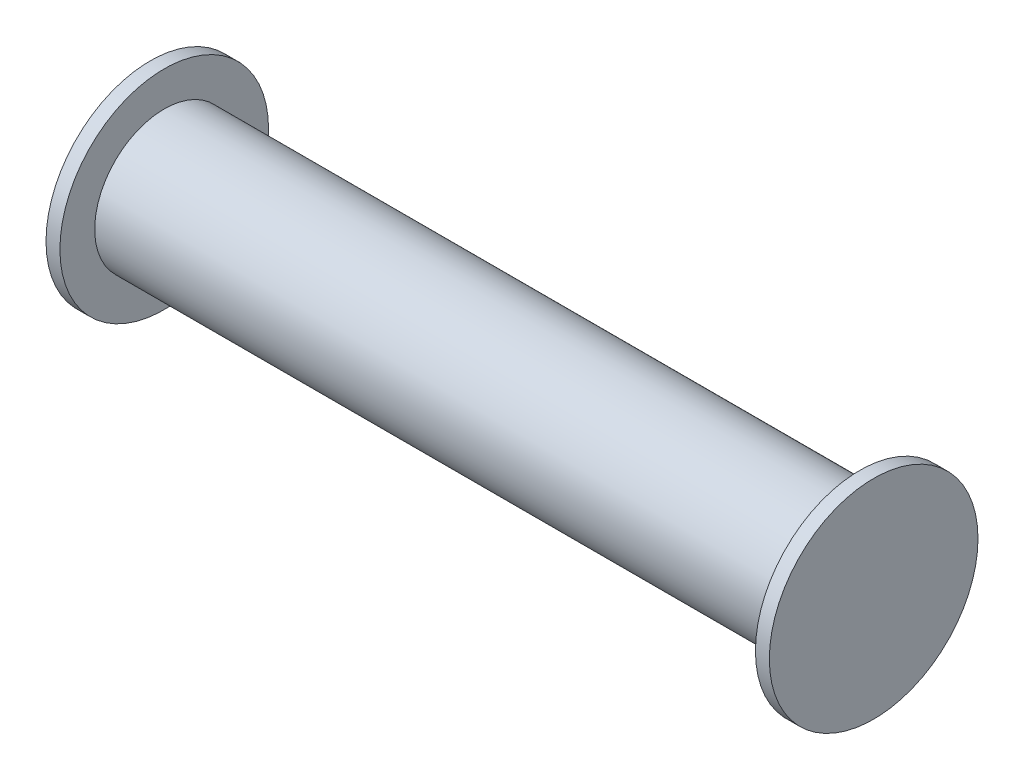
ISO-10303-21;
HEADER;
FILE_DESCRIPTION(('STEP AP214'),'2;1');
FILE_NAME('part.step','',(''),(''),'','','');
FILE_SCHEMA(('AUTOMOTIVE_DESIGN { 1 0 10303 214 1 1 1 1 }'));
ENDSEC;
DATA;
#1=APPLICATION_CONTEXT('core data for automotive mechanical design processes');
#2=APPLICATION_PROTOCOL_DEFINITION('international standard','automotive_design',2000,#1);
#3=PRODUCT_CONTEXT('',#1,'mechanical');
#4=PRODUCT('Part','Part','',(#3));
#5=PRODUCT_RELATED_PRODUCT_CATEGORY('part','',(#4));
#6=PRODUCT_DEFINITION_FORMATION('','',#4);
#7=PRODUCT_DEFINITION_CONTEXT('part definition',#1,'design');
#8=PRODUCT_DEFINITION('design','',#6,#7);
#9=PRODUCT_DEFINITION_SHAPE('','',#8);
#10=(LENGTH_UNIT() NAMED_UNIT(*) SI_UNIT(.MILLI.,.METRE.));
#11=(NAMED_UNIT(*) PLANE_ANGLE_UNIT() SI_UNIT($,.RADIAN.));
#12=(NAMED_UNIT(*) SI_UNIT($,.STERADIAN.) SOLID_ANGLE_UNIT());
#13=UNCERTAINTY_MEASURE_WITH_UNIT(LENGTH_MEASURE(1.E-05),#10,'distance_accuracy_value','');
#14=(GEOMETRIC_REPRESENTATION_CONTEXT(3) GLOBAL_UNCERTAINTY_ASSIGNED_CONTEXT((#13)) GLOBAL_UNIT_ASSIGNED_CONTEXT((#10,
#11,#12)) REPRESENTATION_CONTEXT('',''));
#15=CARTESIAN_POINT('',(0.,0.,0.));
#16=DIRECTION('',(0.,0.,1.));
#17=DIRECTION('',(1.,0.,0.));
#18=AXIS2_PLACEMENT_3D('',#15,#16,#17);
#19=CARTESIAN_POINT('',(-52.,0.,0.));
#20=DIRECTION('',(1.,0.,0.));
#21=DIRECTION('',(0.,0.,-1.));
#22=AXIS2_PLACEMENT_3D('',#19,#20,#21);
#23=CYLINDRICAL_SURFACE('',#22,15.);
#24=CARTESIAN_POINT('',(-52.,0.,0.));
#25=DIRECTION('',(-1.,0.,0.));
#26=DIRECTION('',(0.,0.,1.));
#27=AXIS2_PLACEMENT_3D('',#24,#25,#26);
#28=CIRCLE('',#27,15.);
#29=CARTESIAN_POINT('',(-52.,0.,15.));
#30=VERTEX_POINT('',#29);
#31=EDGE_CURVE('E11',#30,#30,#28,.T.);
#32=ORIENTED_EDGE('',*,*,#31,.F.);
#33=EDGE_LOOP('',(#32));
#34=FACE_BOUND('',#33,.T.);
#35=CARTESIAN_POINT('',(-50.,0.,0.));
#36=DIRECTION('',(-1.,0.,0.));
#37=DIRECTION('',(0.,0.,1.));
#38=AXIS2_PLACEMENT_3D('',#35,#36,#37);
#39=CIRCLE('',#38,15.);
#40=CARTESIAN_POINT('',(-50.,0.,15.));
#41=VERTEX_POINT('',#40);
#42=EDGE_CURVE('E51',#41,#41,#39,.T.);
#43=ORIENTED_EDGE('',*,*,#42,.T.);
#44=EDGE_LOOP('',(#43));
#45=FACE_BOUND('',#44,.T.);
#46=ADVANCED_FACE('F48',(#34,#45),#23,.T.);
#47=CARTESIAN_POINT('',(-52.,0.,0.));
#48=DIRECTION('',(-1.,0.,0.));
#49=DIRECTION('',(0.,0.,1.));
#50=AXIS2_PLACEMENT_3D('',#47,#48,#49);
#51=PLANE('',#50);
#52=ORIENTED_EDGE('',*,*,#31,.T.);
#53=EDGE_LOOP('',(#52));
#54=FACE_BOUND('',#53,.T.);
#55=ADVANCED_FACE('F63',(#54),#51,.T.);
#56=CARTESIAN_POINT('',(-50.,0.,0.));
#57=DIRECTION('',(-1.,0.,0.));
#58=DIRECTION('',(0.,0.,1.));
#59=AXIS2_PLACEMENT_3D('',#56,#57,#58);
#60=PLANE('',#59);
#61=ORIENTED_EDGE('',*,*,#42,.F.);
#62=EDGE_LOOP('',(#61));
#63=FACE_BOUND('',#62,.T.);
#64=ADVANCED_FACE('F61',(#63),#60,.F.);
#65=CLOSED_SHELL('',(#46,#55,#64));
#66=MANIFOLD_SOLID_BREP('B2',#65);
#67=CARTESIAN_POINT('',(52.,0.,0.));
#68=DIRECTION('',(-1.,0.,0.));
#69=DIRECTION('',(0.,0.,1.));
#70=AXIS2_PLACEMENT_3D('',#67,#68,#69);
#71=CYLINDRICAL_SURFACE('',#70,15.);
#72=CARTESIAN_POINT('',(52.,0.,0.));
#73=DIRECTION('',(1.,0.,0.));
#74=DIRECTION('',(0.,0.,-1.));
#75=AXIS2_PLACEMENT_3D('',#72,#73,#74);
#76=CIRCLE('',#75,15.);
#77=CARTESIAN_POINT('',(52.,0.,-15.));
#78=VERTEX_POINT('',#77);
#79=EDGE_CURVE('E47',#78,#78,#76,.T.);
#80=ORIENTED_EDGE('',*,*,#79,.F.);
#81=EDGE_LOOP('',(#80));
#82=FACE_BOUND('',#81,.T.);
#83=CARTESIAN_POINT('',(50.,0.,0.));
#84=DIRECTION('',(1.,0.,0.));
#85=DIRECTION('',(0.,0.,-1.));
#86=AXIS2_PLACEMENT_3D('',#83,#84,#85);
#87=CIRCLE('',#86,15.);
#88=CARTESIAN_POINT('',(50.,0.,-15.));
#89=VERTEX_POINT('',#88);
#90=EDGE_CURVE('E103',#89,#89,#87,.T.);
#91=ORIENTED_EDGE('',*,*,#90,.T.);
#92=EDGE_LOOP('',(#91));
#93=FACE_BOUND('',#92,.T.);
#94=ADVANCED_FACE('F100',(#82,#93),#71,.T.);
#95=CARTESIAN_POINT('',(52.,0.,0.));
#96=DIRECTION('',(1.,0.,0.));
#97=DIRECTION('',(0.,0.,-1.));
#98=AXIS2_PLACEMENT_3D('',#95,#96,#97);
#99=PLANE('',#98);
#100=ORIENTED_EDGE('',*,*,#79,.T.);
#101=EDGE_LOOP('',(#100));
#102=FACE_BOUND('',#101,.T.);
#103=ADVANCED_FACE('F115',(#102),#99,.T.);
#104=CARTESIAN_POINT('',(50.,0.,0.));
#105=DIRECTION('',(1.,0.,0.));
#106=DIRECTION('',(0.,0.,-1.));
#107=AXIS2_PLACEMENT_3D('',#104,#105,#106);
#108=PLANE('',#107);
#109=ORIENTED_EDGE('',*,*,#90,.F.);
#110=EDGE_LOOP('',(#109));
#111=FACE_BOUND('',#110,.T.);
#112=ADVANCED_FACE('F113',(#111),#108,.F.);
#113=CLOSED_SHELL('',(#94,#103,#112));
#114=MANIFOLD_SOLID_BREP('B6',#113);
#115=CARTESIAN_POINT('',(50.,0.,0.));
#116=DIRECTION('',(1.,0.,0.));
#117=DIRECTION('',(0.,0.,-1.));
#118=AXIS2_PLACEMENT_3D('',#115,#116,#117);
#119=PLANE('',#118);
#120=CARTESIAN_POINT('',(50.,0.,0.));
#121=DIRECTION('',(1.,0.,0.));
#122=DIRECTION('',(0.,0.,-1.));
#123=AXIS2_PLACEMENT_3D('',#120,#121,#122);
#124=CIRCLE('',#123,10.);
#125=CARTESIAN_POINT('',(50.,0.,-10.));
#126=VERTEX_POINT('',#125);
#127=EDGE_CURVE('E99',#126,#126,#124,.T.);
#128=ORIENTED_EDGE('',*,*,#127,.T.);
#129=EDGE_LOOP('',(#128));
#130=FACE_BOUND('',#129,.T.);
#131=CARTESIAN_POINT('',(50.,0.,0.));
#132=DIRECTION('',(1.,0.,0.));
#133=DIRECTION('',(0.,0.,-1.));
#134=AXIS2_PLACEMENT_3D('',#131,#132,#133);
#135=CIRCLE('',#134,8.);
#136=CARTESIAN_POINT('',(50.,0.,-8.));
#137=VERTEX_POINT('',#136);
#138=EDGE_CURVE('E156',#137,#137,#135,.T.);
#139=ORIENTED_EDGE('',*,*,#138,.F.);
#140=EDGE_LOOP('',(#139));
#141=FACE_BOUND('',#140,.T.);
#142=ADVANCED_FACE('F145',(#130,#141),#119,.T.);
#143=CARTESIAN_POINT('',(-50.,0.,0.));
#144=DIRECTION('',(1.,0.,0.));
#145=DIRECTION('',(0.,0.,-1.));
#146=AXIS2_PLACEMENT_3D('',#143,#144,#145);
#147=PLANE('',#146);
#148=CARTESIAN_POINT('',(-50.,0.,0.));
#149=DIRECTION('',(1.,0.,0.));
#150=DIRECTION('',(0.,0.,-1.));
#151=AXIS2_PLACEMENT_3D('',#148,#149,#150);
#152=CIRCLE('',#151,10.);
#153=CARTESIAN_POINT('',(-50.,0.,-10.));
#154=VERTEX_POINT('',#153);
#155=EDGE_CURVE('E149',#154,#154,#152,.T.);
#156=ORIENTED_EDGE('',*,*,#155,.F.);
#157=EDGE_LOOP('',(#156));
#158=FACE_BOUND('',#157,.T.);
#159=CARTESIAN_POINT('',(-50.,0.,0.));
#160=DIRECTION('',(1.,0.,0.));
#161=DIRECTION('',(0.,0.,-1.));
#162=AXIS2_PLACEMENT_3D('',#159,#160,#161);
#163=CIRCLE('',#162,8.);
#164=CARTESIAN_POINT('',(-50.,0.,-8.));
#165=VERTEX_POINT('',#164);
#166=EDGE_CURVE('E158',#165,#165,#163,.T.);
#167=ORIENTED_EDGE('',*,*,#166,.T.);
#168=EDGE_LOOP('',(#167));
#169=FACE_BOUND('',#168,.T.);
#170=ADVANCED_FACE('F168',(#158,#169),#147,.F.);
#171=CARTESIAN_POINT('',(50.,0.,0.));
#172=DIRECTION('',(-1.,0.,0.));
#173=DIRECTION('',(0.,0.,1.));
#174=AXIS2_PLACEMENT_3D('',#171,#172,#173);
#175=CYLINDRICAL_SURFACE('',#174,10.);
#176=ORIENTED_EDGE('',*,*,#127,.F.);
#177=EDGE_LOOP('',(#176));
#178=FACE_BOUND('',#177,.T.);
#179=ORIENTED_EDGE('',*,*,#155,.T.);
#180=EDGE_LOOP('',(#179));
#181=FACE_BOUND('',#180,.T.);
#182=ADVANCED_FACE('F147',(#178,#181),#175,.T.);
#183=CARTESIAN_POINT('',(50.,0.,0.));
#184=DIRECTION('',(-1.,0.,0.));
#185=DIRECTION('',(0.,0.,1.));
#186=AXIS2_PLACEMENT_3D('',#183,#184,#185);
#187=CYLINDRICAL_SURFACE('',#186,8.);
#188=ORIENTED_EDGE('',*,*,#138,.T.);
#189=EDGE_LOOP('',(#188));
#190=FACE_BOUND('',#189,.T.);
#191=ORIENTED_EDGE('',*,*,#166,.F.);
#192=EDGE_LOOP('',(#191));
#193=FACE_BOUND('',#192,.T.);
#194=ADVANCED_FACE('F164',(#190,#193),#187,.F.);
#195=CLOSED_SHELL('',(#142,#170,#182,#194));
#196=MANIFOLD_SOLID_BREP('B42_NOT_SHOWN',#195);
#197=ADVANCED_BREP_SHAPE_REPRESENTATION('',(#18,#66,#114,#196),#14);
#198=SHAPE_DEFINITION_REPRESENTATION(#9,#197);
ENDSEC;
END-ISO-10303-21;
